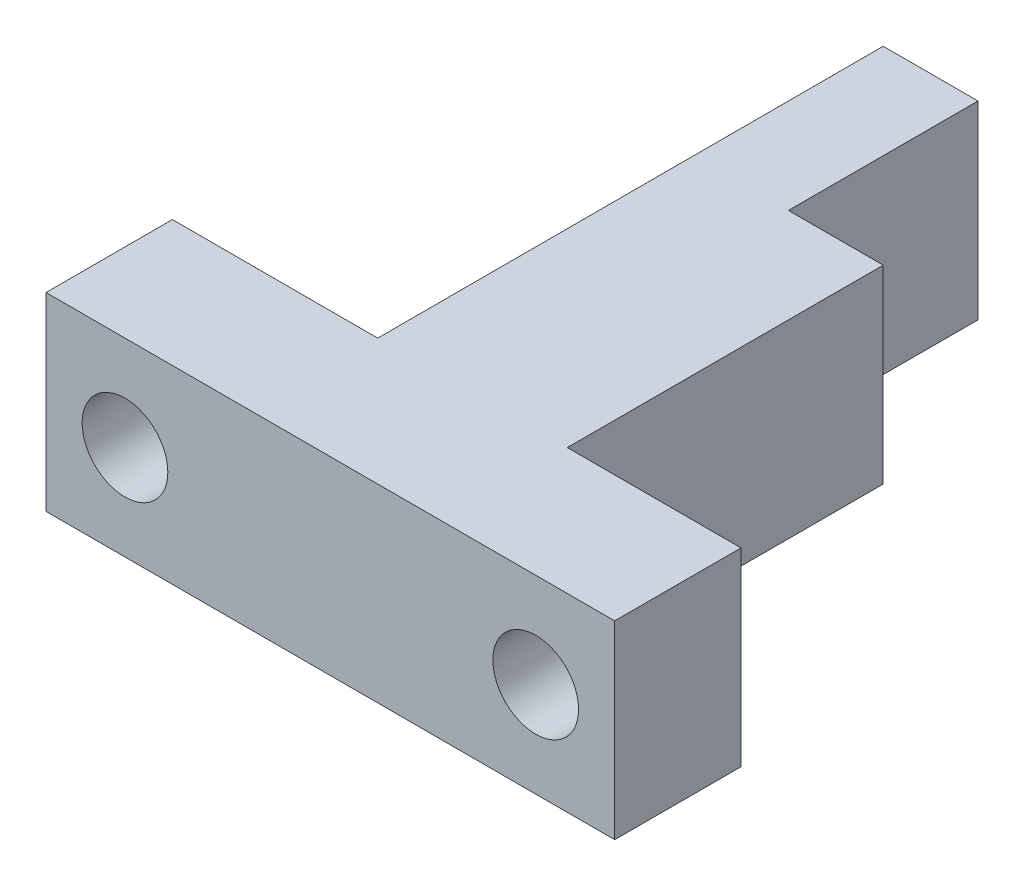
ISO-10303-21;
HEADER;
FILE_DESCRIPTION(('STEP AP214'),'2;1');
FILE_NAME('part.step','',(''),(''),'','','');
FILE_SCHEMA(('AUTOMOTIVE_DESIGN { 1 0 10303 214 1 1 1 1 }'));
ENDSEC;
DATA;
#1=APPLICATION_CONTEXT('core data for automotive mechanical design processes');
#2=APPLICATION_PROTOCOL_DEFINITION('international standard','automotive_design',2000,#1);
#3=PRODUCT_CONTEXT('',#1,'mechanical');
#4=PRODUCT('Part','Part','',(#3));
#5=PRODUCT_RELATED_PRODUCT_CATEGORY('part','',(#4));
#6=PRODUCT_DEFINITION_FORMATION('','',#4);
#7=PRODUCT_DEFINITION_CONTEXT('part definition',#1,'design');
#8=PRODUCT_DEFINITION('design','',#6,#7);
#9=PRODUCT_DEFINITION_SHAPE('','',#8);
#10=(LENGTH_UNIT() NAMED_UNIT(*) SI_UNIT(.MILLI.,.METRE.));
#11=(NAMED_UNIT(*) PLANE_ANGLE_UNIT() SI_UNIT($,.RADIAN.));
#12=(NAMED_UNIT(*) SI_UNIT($,.STERADIAN.) SOLID_ANGLE_UNIT());
#13=UNCERTAINTY_MEASURE_WITH_UNIT(LENGTH_MEASURE(1.E-05),#10,'distance_accuracy_value','');
#14=(GEOMETRIC_REPRESENTATION_CONTEXT(3) GLOBAL_UNCERTAINTY_ASSIGNED_CONTEXT((#13)) GLOBAL_UNIT_ASSIGNED_CONTEXT((#10,
#11,#12)) REPRESENTATION_CONTEXT('',''));
#15=CARTESIAN_POINT('',(0.,0.,0.));
#16=DIRECTION('',(0.,0.,1.));
#17=DIRECTION('',(1.,0.,0.));
#18=AXIS2_PLACEMENT_3D('',#15,#16,#17);
#19=CARTESIAN_POINT('',(-14.2875,9.525,0.));
#20=DIRECTION('',(1.,0.,0.));
#21=DIRECTION('',(0.,0.,-1.));
#22=AXIS2_PLACEMENT_3D('',#19,#20,#21);
#23=PLANE('',#22);
#24=DIRECTION('',(0.,0.,1.));
#25=VECTOR('',#24,1.);
#26=CARTESIAN_POINT('',(-14.2875,0.,0.));
#27=LINE('',#26,#25);
#28=CARTESIAN_POINT('',(-14.2875,0.,-6.35));
#29=VERTEX_POINT('',#28);
#30=CARTESIAN_POINT('',(-14.2875,0.,0.));
#31=VERTEX_POINT('',#30);
#32=EDGE_CURVE('E145',#29,#31,#27,.T.);
#33=ORIENTED_EDGE('',*,*,#32,.T.);
#34=DIRECTION('',(0.,-1.,0.));
#35=VECTOR('',#34,1.);
#36=CARTESIAN_POINT('',(-14.2875,9.525,0.));
#37=LINE('',#36,#35);
#38=CARTESIAN_POINT('',(-14.2875,9.525,0.));
#39=VERTEX_POINT('',#38);
#40=EDGE_CURVE('E11',#39,#31,#37,.T.);
#41=ORIENTED_EDGE('',*,*,#40,.F.);
#42=DIRECTION('',(0.,0.,1.));
#43=VECTOR('',#42,1.);
#44=CARTESIAN_POINT('',(-14.2875,9.525,0.));
#45=LINE('',#44,#43);
#46=CARTESIAN_POINT('',(-14.2875,9.525,-6.35));
#47=VERTEX_POINT('',#46);
#48=EDGE_CURVE('E164',#47,#39,#45,.T.);
#49=ORIENTED_EDGE('',*,*,#48,.F.);
#50=DIRECTION('',(0.,-1.,0.));
#51=VECTOR('',#50,1.);
#52=CARTESIAN_POINT('',(-14.2875,9.525,-6.35));
#53=LINE('',#52,#51);
#54=EDGE_CURVE('E141',#47,#29,#53,.T.);
#55=ORIENTED_EDGE('',*,*,#54,.T.);
#56=EDGE_LOOP('',(#33,#41,#49,#55));
#57=FACE_BOUND('',#56,.T.);
#58=ADVANCED_FACE('F35',(#57),#23,.F.);
#59=CARTESIAN_POINT('',(-14.2875,9.525,0.));
#60=DIRECTION('',(0.,0.,-1.));
#61=DIRECTION('',(-1.,0.,0.));
#62=AXIS2_PLACEMENT_3D('',#59,#60,#61);
#63=PLANE('',#62);
#64=CARTESIAN_POINT('',(10.31875,4.7625,0.));
#65=DIRECTION('',(0.,0.,1.));
#66=DIRECTION('',(1.,0.,0.));
#67=AXIS2_PLACEMENT_3D('',#64,#65,#66);
#68=CIRCLE('',#67,2.15265);
#69=CARTESIAN_POINT('',(12.4714,4.7625,0.));
#70=VERTEX_POINT('',#69);
#71=EDGE_CURVE('E190',#70,#70,#68,.T.);
#72=ORIENTED_EDGE('',*,*,#71,.F.);
#73=EDGE_LOOP('',(#72));
#74=FACE_BOUND('',#73,.T.);
#75=CARTESIAN_POINT('',(-10.31875,4.7625,0.));
#76=DIRECTION('',(0.,0.,1.));
#77=DIRECTION('',(1.,0.,0.));
#78=AXIS2_PLACEMENT_3D('',#75,#76,#77);
#79=CIRCLE('',#78,2.15265);
#80=CARTESIAN_POINT('',(-8.1661,4.7625,0.));
#81=VERTEX_POINT('',#80);
#82=EDGE_CURVE('E182',#81,#81,#79,.T.);
#83=ORIENTED_EDGE('',*,*,#82,.F.);
#84=EDGE_LOOP('',(#83));
#85=FACE_BOUND('',#84,.T.);
#86=DIRECTION('',(1.,0.,0.));
#87=VECTOR('',#86,1.);
#88=CARTESIAN_POINT('',(-14.2875,0.,0.));
#89=LINE('',#88,#87);
#90=CARTESIAN_POINT('',(14.2875,0.,0.));
#91=VERTEX_POINT('',#90);
#92=EDGE_CURVE('E148',#31,#91,#89,.T.);
#93=ORIENTED_EDGE('',*,*,#92,.T.);
#94=DIRECTION('',(0.,-1.,0.));
#95=VECTOR('',#94,1.);
#96=CARTESIAN_POINT('',(14.2875,9.525,0.));
#97=LINE('',#96,#95);
#98=CARTESIAN_POINT('',(14.2875,9.525,0.));
#99=VERTEX_POINT('',#98);
#100=EDGE_CURVE('E44',#99,#91,#97,.T.);
#101=ORIENTED_EDGE('',*,*,#100,.F.);
#102=DIRECTION('',(1.,0.,0.));
#103=VECTOR('',#102,1.);
#104=CARTESIAN_POINT('',(-14.2875,9.525,0.));
#105=LINE('',#104,#103);
#106=EDGE_CURVE('E102',#39,#99,#105,.T.);
#107=ORIENTED_EDGE('',*,*,#106,.F.);
#108=ORIENTED_EDGE('',*,*,#40,.T.);
#109=EDGE_LOOP('',(#93,#101,#107,#108));
#110=FACE_BOUND('',#109,.T.);
#111=ADVANCED_FACE('F230',(#74,#85,#110),#63,.F.);
#112=CARTESIAN_POINT('',(14.2875,9.525,-6.35));
#113=DIRECTION('',(-1.,0.,0.));
#114=DIRECTION('',(0.,0.,1.));
#115=AXIS2_PLACEMENT_3D('',#112,#113,#114);
#116=PLANE('',#115);
#117=DIRECTION('',(0.,0.,-1.));
#118=VECTOR('',#117,1.);
#119=CARTESIAN_POINT('',(14.2875,0.,-6.35));
#120=LINE('',#119,#118);
#121=CARTESIAN_POINT('',(14.2875,0.,-6.35));
#122=VERTEX_POINT('',#121);
#123=EDGE_CURVE('E151',#91,#122,#120,.T.);
#124=ORIENTED_EDGE('',*,*,#123,.T.);
#125=DIRECTION('',(0.,-1.,0.));
#126=VECTOR('',#125,1.);
#127=CARTESIAN_POINT('',(14.2875,9.525,-6.35));
#128=LINE('',#127,#126);
#129=CARTESIAN_POINT('',(14.2875,9.525,-6.35));
#130=VERTEX_POINT('',#129);
#131=EDGE_CURVE('E177',#130,#122,#128,.T.);
#132=ORIENTED_EDGE('',*,*,#131,.F.);
#133=DIRECTION('',(0.,0.,-1.));
#134=VECTOR('',#133,1.);
#135=CARTESIAN_POINT('',(14.2875,9.525,-6.35));
#136=LINE('',#135,#134);
#137=EDGE_CURVE('E195',#99,#130,#136,.T.);
#138=ORIENTED_EDGE('',*,*,#137,.F.);
#139=ORIENTED_EDGE('',*,*,#100,.T.);
#140=EDGE_LOOP('',(#124,#132,#138,#139));
#141=FACE_BOUND('',#140,.T.);
#142=ADVANCED_FACE('F234',(#141),#116,.F.);
#143=CARTESIAN_POINT('',(5.55625,9.525,-6.35));
#144=DIRECTION('',(0.,0.,1.));
#145=DIRECTION('',(1.,0.,0.));
#146=AXIS2_PLACEMENT_3D('',#143,#144,#145);
#147=PLANE('',#146);
#148=CARTESIAN_POINT('',(10.31875,4.7625,-6.35));
#149=DIRECTION('',(0.,0.,1.));
#150=DIRECTION('',(1.,0.,0.));
#151=AXIS2_PLACEMENT_3D('',#148,#149,#150);
#152=CIRCLE('',#151,2.15265);
#153=CARTESIAN_POINT('',(12.4714,4.7625,-6.35000000000001));
#154=VERTEX_POINT('',#153);
#155=EDGE_CURVE('E38',#154,#154,#152,.T.);
#156=ORIENTED_EDGE('',*,*,#155,.T.);
#157=EDGE_LOOP('',(#156));
#158=FACE_BOUND('',#157,.T.);
#159=DIRECTION('',(-1.,0.,0.));
#160=VECTOR('',#159,1.);
#161=CARTESIAN_POINT('',(5.55625,0.,-6.35));
#162=LINE('',#161,#160);
#163=CARTESIAN_POINT('',(5.55625,0.,-6.35));
#164=VERTEX_POINT('',#163);
#165=EDGE_CURVE('E153',#122,#164,#162,.T.);
#166=ORIENTED_EDGE('',*,*,#165,.T.);
#167=DIRECTION('',(0.,-1.,0.));
#168=VECTOR('',#167,1.);
#169=CARTESIAN_POINT('',(5.55625,9.525,-6.35));
#170=LINE('',#169,#168);
#171=CARTESIAN_POINT('',(5.55625,9.525,-6.35));
#172=VERTEX_POINT('',#171);
#173=EDGE_CURVE('E174',#172,#164,#170,.T.);
#174=ORIENTED_EDGE('',*,*,#173,.F.);
#175=DIRECTION('',(-1.,0.,0.));
#176=VECTOR('',#175,1.);
#177=CARTESIAN_POINT('',(5.55625,9.525,-6.35));
#178=LINE('',#177,#176);
#179=EDGE_CURVE('E197',#130,#172,#178,.T.);
#180=ORIENTED_EDGE('',*,*,#179,.F.);
#181=ORIENTED_EDGE('',*,*,#131,.T.);
#182=EDGE_LOOP('',(#166,#174,#180,#181));
#183=FACE_BOUND('',#182,.T.);
#184=ADVANCED_FACE('F239',(#158,#183),#147,.F.);
#185=CARTESIAN_POINT('',(5.55624999999999,9.525,-22.225));
#186=DIRECTION('',(-1.,0.,0.));
#187=DIRECTION('',(0.,0.,1.));
#188=AXIS2_PLACEMENT_3D('',#185,#186,#187);
#189=PLANE('',#188);
#190=DIRECTION('',(0.,0.,-1.));
#191=VECTOR('',#190,1.);
#192=CARTESIAN_POINT('',(5.55624999999999,0.,-22.225));
#193=LINE('',#192,#191);
#194=CARTESIAN_POINT('',(5.55624999999999,0.,-22.225));
#195=VERTEX_POINT('',#194);
#196=EDGE_CURVE('E155',#164,#195,#193,.T.);
#197=ORIENTED_EDGE('',*,*,#196,.T.);
#198=DIRECTION('',(0.,-1.,0.));
#199=VECTOR('',#198,1.);
#200=CARTESIAN_POINT('',(5.55624999999999,9.525,-22.225));
#201=LINE('',#200,#199);
#202=CARTESIAN_POINT('',(5.55624999999999,9.525,-22.225));
#203=VERTEX_POINT('',#202);
#204=EDGE_CURVE('E171',#203,#195,#201,.T.);
#205=ORIENTED_EDGE('',*,*,#204,.F.);
#206=DIRECTION('',(0.,0.,-1.));
#207=VECTOR('',#206,1.);
#208=CARTESIAN_POINT('',(5.55624999999999,9.525,-22.225));
#209=LINE('',#208,#207);
#210=EDGE_CURVE('E199',#172,#203,#209,.T.);
#211=ORIENTED_EDGE('',*,*,#210,.F.);
#212=ORIENTED_EDGE('',*,*,#173,.T.);
#213=EDGE_LOOP('',(#197,#205,#211,#212));
#214=FACE_BOUND('',#213,.T.);
#215=ADVANCED_FACE('F247',(#214),#189,.F.);
#216=CARTESIAN_POINT('',(0.793749999999994,9.525,-22.225));
#217=DIRECTION('',(0.,0.,1.));
#218=DIRECTION('',(1.,0.,0.));
#219=AXIS2_PLACEMENT_3D('',#216,#217,#218);
#220=PLANE('',#219);
#221=DIRECTION('',(-1.,0.,0.));
#222=VECTOR('',#221,1.);
#223=CARTESIAN_POINT('',(0.793749999999994,0.,-22.225));
#224=LINE('',#223,#222);
#225=CARTESIAN_POINT('',(0.793749999999994,0.,-22.225));
#226=VERTEX_POINT('',#225);
#227=EDGE_CURVE('E157',#195,#226,#224,.T.);
#228=ORIENTED_EDGE('',*,*,#227,.T.);
#229=DIRECTION('',(0.,-1.,0.));
#230=VECTOR('',#229,1.);
#231=CARTESIAN_POINT('',(0.793749999999994,9.525,-22.225));
#232=LINE('',#231,#230);
#233=CARTESIAN_POINT('',(0.793749999999994,9.525,-22.225));
#234=VERTEX_POINT('',#233);
#235=EDGE_CURVE('E168',#234,#226,#232,.T.);
#236=ORIENTED_EDGE('',*,*,#235,.F.);
#237=DIRECTION('',(-1.,0.,0.));
#238=VECTOR('',#237,1.);
#239=CARTESIAN_POINT('',(0.793749999999994,9.525,-22.225));
#240=LINE('',#239,#238);
#241=EDGE_CURVE('E201',#203,#234,#240,.T.);
#242=ORIENTED_EDGE('',*,*,#241,.F.);
#243=ORIENTED_EDGE('',*,*,#204,.T.);
#244=EDGE_LOOP('',(#228,#236,#242,#243));
#245=FACE_BOUND('',#244,.T.);
#246=ADVANCED_FACE('F207',(#245),#220,.F.);
#247=CARTESIAN_POINT('',(0.79374999999999,9.525,-31.75));
#248=DIRECTION('',(-1.,0.,0.));
#249=DIRECTION('',(0.,0.,1.));
#250=AXIS2_PLACEMENT_3D('',#247,#248,#249);
#251=PLANE('',#250);
#252=DIRECTION('',(0.,0.,-1.));
#253=VECTOR('',#252,1.);
#254=CARTESIAN_POINT('',(0.79374999999999,0.,-31.75));
#255=LINE('',#254,#253);
#256=CARTESIAN_POINT('',(0.79374999999999,0.,-31.75));
#257=VERTEX_POINT('',#256);
#258=EDGE_CURVE('E159',#226,#257,#255,.T.);
#259=ORIENTED_EDGE('',*,*,#258,.T.);
#260=DIRECTION('',(0.,-1.,0.));
#261=VECTOR('',#260,1.);
#262=CARTESIAN_POINT('',(0.79374999999999,9.525,-31.75));
#263=LINE('',#262,#261);
#264=CARTESIAN_POINT('',(0.79374999999999,9.525,-31.75));
#265=VERTEX_POINT('',#264);
#266=EDGE_CURVE('E136',#265,#257,#263,.T.);
#267=ORIENTED_EDGE('',*,*,#266,.F.);
#268=DIRECTION('',(0.,0.,-1.));
#269=VECTOR('',#268,1.);
#270=CARTESIAN_POINT('',(0.79374999999999,9.525,-31.75));
#271=LINE('',#270,#269);
#272=EDGE_CURVE('E127',#234,#265,#271,.T.);
#273=ORIENTED_EDGE('',*,*,#272,.F.);
#274=ORIENTED_EDGE('',*,*,#235,.T.);
#275=EDGE_LOOP('',(#259,#267,#273,#274));
#276=FACE_BOUND('',#275,.T.);
#277=ADVANCED_FACE('F211',(#276),#251,.F.);
#278=CARTESIAN_POINT('',(-3.96875000000001,9.525,-31.75));
#279=DIRECTION('',(0.,0.,1.));
#280=DIRECTION('',(1.,0.,0.));
#281=AXIS2_PLACEMENT_3D('',#278,#279,#280);
#282=PLANE('',#281);
#283=DIRECTION('',(-1.,0.,0.));
#284=VECTOR('',#283,1.);
#285=CARTESIAN_POINT('',(-3.96875000000001,0.,-31.75));
#286=LINE('',#285,#284);
#287=CARTESIAN_POINT('',(-3.96875000000001,0.,-31.75));
#288=VERTEX_POINT('',#287);
#289=EDGE_CURVE('E135',#257,#288,#286,.T.);
#290=ORIENTED_EDGE('',*,*,#289,.T.);
#291=DIRECTION('',(0.,-1.,0.));
#292=VECTOR('',#291,1.);
#293=CARTESIAN_POINT('',(-3.96875000000001,9.525,-31.75));
#294=LINE('',#293,#292);
#295=CARTESIAN_POINT('',(-3.96875000000001,9.525,-31.75));
#296=VERTEX_POINT('',#295);
#297=EDGE_CURVE('E132',#296,#288,#294,.T.);
#298=ORIENTED_EDGE('',*,*,#297,.F.);
#299=DIRECTION('',(-1.,0.,0.));
#300=VECTOR('',#299,1.);
#301=CARTESIAN_POINT('',(-3.96875000000001,9.525,-31.75));
#302=LINE('',#301,#300);
#303=EDGE_CURVE('E121',#265,#296,#302,.T.);
#304=ORIENTED_EDGE('',*,*,#303,.F.);
#305=ORIENTED_EDGE('',*,*,#266,.T.);
#306=EDGE_LOOP('',(#290,#298,#304,#305));
#307=FACE_BOUND('',#306,.T.);
#308=ADVANCED_FACE('F133',(#307),#282,.F.);
#309=CARTESIAN_POINT('',(-3.96875000000001,9.525,-6.35));
#310=DIRECTION('',(1.,0.,0.));
#311=DIRECTION('',(0.,0.,-1.));
#312=AXIS2_PLACEMENT_3D('',#309,#310,#311);
#313=PLANE('',#312);
#314=DIRECTION('',(0.,0.,1.));
#315=VECTOR('',#314,1.);
#316=CARTESIAN_POINT('',(-3.96875000000001,0.,-6.35));
#317=LINE('',#316,#315);
#318=CARTESIAN_POINT('',(-3.96875000000001,0.,-6.35));
#319=VERTEX_POINT('',#318);
#320=EDGE_CURVE('E88',#288,#319,#317,.T.);
#321=ORIENTED_EDGE('',*,*,#320,.T.);
#322=DIRECTION('',(0.,-1.,0.));
#323=VECTOR('',#322,1.);
#324=CARTESIAN_POINT('',(-3.96875000000001,9.525,-6.35));
#325=LINE('',#324,#323);
#326=CARTESIAN_POINT('',(-3.96875000000001,9.525,-6.35));
#327=VERTEX_POINT('',#326);
#328=EDGE_CURVE('E137',#327,#319,#325,.T.);
#329=ORIENTED_EDGE('',*,*,#328,.F.);
#330=DIRECTION('',(0.,0.,1.));
#331=VECTOR('',#330,1.);
#332=CARTESIAN_POINT('',(-3.96875000000001,9.525,-6.35));
#333=LINE('',#332,#331);
#334=EDGE_CURVE('E125',#296,#327,#333,.T.);
#335=ORIENTED_EDGE('',*,*,#334,.F.);
#336=ORIENTED_EDGE('',*,*,#297,.T.);
#337=EDGE_LOOP('',(#321,#329,#335,#336));
#338=FACE_BOUND('',#337,.T.);
#339=ADVANCED_FACE('F139',(#338),#313,.F.);
#340=CARTESIAN_POINT('',(-14.2875,9.525,-6.35));
#341=DIRECTION('',(0.,0.,1.));
#342=DIRECTION('',(1.,0.,0.));
#343=AXIS2_PLACEMENT_3D('',#340,#341,#342);
#344=PLANE('',#343);
#345=CARTESIAN_POINT('',(-10.31875,4.7625,-6.35));
#346=DIRECTION('',(0.,0.,1.));
#347=DIRECTION('',(1.,0.,0.));
#348=AXIS2_PLACEMENT_3D('',#345,#346,#347);
#349=CIRCLE('',#348,2.15265);
#350=CARTESIAN_POINT('',(-8.1661,4.7625,-6.35));
#351=VERTEX_POINT('',#350);
#352=EDGE_CURVE('E149',#351,#351,#349,.T.);
#353=ORIENTED_EDGE('',*,*,#352,.T.);
#354=EDGE_LOOP('',(#353));
#355=FACE_BOUND('',#354,.T.);
#356=DIRECTION('',(-1.,0.,0.));
#357=VECTOR('',#356,1.);
#358=CARTESIAN_POINT('',(-14.2875,0.,-6.35));
#359=LINE('',#358,#357);
#360=EDGE_CURVE('E94',#319,#29,#359,.T.);
#361=ORIENTED_EDGE('',*,*,#360,.T.);
#362=ORIENTED_EDGE('',*,*,#54,.F.);
#363=DIRECTION('',(-1.,0.,0.));
#364=VECTOR('',#363,1.);
#365=CARTESIAN_POINT('',(-14.2875,9.525,-6.35));
#366=LINE('',#365,#364);
#367=EDGE_CURVE('E53',#327,#47,#366,.T.);
#368=ORIENTED_EDGE('',*,*,#367,.F.);
#369=ORIENTED_EDGE('',*,*,#328,.T.);
#370=EDGE_LOOP('',(#361,#362,#368,#369));
#371=FACE_BOUND('',#370,.T.);
#372=ADVANCED_FACE('F219',(#355,#371),#344,.F.);
#373=CARTESIAN_POINT('',(0.,9.525,0.));
#374=DIRECTION('',(0.,-1.,0.));
#375=DIRECTION('',(0.,0.,-1.));
#376=AXIS2_PLACEMENT_3D('',#373,#374,#375);
#377=PLANE('',#376);
#378=ORIENTED_EDGE('',*,*,#48,.T.);
#379=ORIENTED_EDGE('',*,*,#106,.T.);
#380=ORIENTED_EDGE('',*,*,#137,.T.);
#381=ORIENTED_EDGE('',*,*,#179,.T.);
#382=ORIENTED_EDGE('',*,*,#210,.T.);
#383=ORIENTED_EDGE('',*,*,#241,.T.);
#384=ORIENTED_EDGE('',*,*,#272,.T.);
#385=ORIENTED_EDGE('',*,*,#303,.T.);
#386=ORIENTED_EDGE('',*,*,#334,.T.);
#387=ORIENTED_EDGE('',*,*,#367,.T.);
#388=EDGE_LOOP('',(#378,#379,#380,#381,#382,#383,#384,#385,#386,#387));
#389=FACE_BOUND('',#388,.T.);
#390=ADVANCED_FACE('F123',(#389),#377,.F.);
#391=CARTESIAN_POINT('',(0.,0.,0.));
#392=DIRECTION('',(0.,-1.,0.));
#393=DIRECTION('',(0.,0.,-1.));
#394=AXIS2_PLACEMENT_3D('',#391,#392,#393);
#395=PLANE('',#394);
#396=ORIENTED_EDGE('',*,*,#32,.F.);
#397=ORIENTED_EDGE('',*,*,#360,.F.);
#398=ORIENTED_EDGE('',*,*,#320,.F.);
#399=ORIENTED_EDGE('',*,*,#289,.F.);
#400=ORIENTED_EDGE('',*,*,#258,.F.);
#401=ORIENTED_EDGE('',*,*,#227,.F.);
#402=ORIENTED_EDGE('',*,*,#196,.F.);
#403=ORIENTED_EDGE('',*,*,#165,.F.);
#404=ORIENTED_EDGE('',*,*,#123,.F.);
#405=ORIENTED_EDGE('',*,*,#92,.F.);
#406=EDGE_LOOP('',(#396,#397,#398,#399,#400,#401,#402,#403,#404,#405));
#407=FACE_BOUND('',#406,.T.);
#408=ADVANCED_FACE('F214',(#407),#395,.T.);
#409=CARTESIAN_POINT('',(-10.31875,4.7625,-31.75));
#410=DIRECTION('',(0.,0.,1.));
#411=DIRECTION('',(1.,0.,0.));
#412=AXIS2_PLACEMENT_3D('',#409,#410,#411);
#413=CYLINDRICAL_SURFACE('',#412,2.15265);
#414=ORIENTED_EDGE('',*,*,#82,.T.);
#415=EDGE_LOOP('',(#414));
#416=FACE_BOUND('',#415,.T.);
#417=ORIENTED_EDGE('',*,*,#352,.F.);
#418=EDGE_LOOP('',(#417));
#419=FACE_BOUND('',#418,.T.);
#420=ADVANCED_FACE('F280',(#416,#419),#413,.F.);
#421=CARTESIAN_POINT('',(10.31875,4.7625,-31.75));
#422=DIRECTION('',(0.,0.,1.));
#423=DIRECTION('',(1.,0.,0.));
#424=AXIS2_PLACEMENT_3D('',#421,#422,#423);
#425=CYLINDRICAL_SURFACE('',#424,2.15265);
#426=ORIENTED_EDGE('',*,*,#71,.T.);
#427=EDGE_LOOP('',(#426));
#428=FACE_BOUND('',#427,.T.);
#429=ORIENTED_EDGE('',*,*,#155,.F.);
#430=EDGE_LOOP('',(#429));
#431=FACE_BOUND('',#430,.T.);
#432=ADVANCED_FACE('F305',(#428,#431),#425,.F.);
#433=CLOSED_SHELL('',(#58,#111,#142,#184,#215,#246,#277,#308,#339,#372,#390,#408,#420,#432));
#434=MANIFOLD_SOLID_BREP('B2',#433);
#435=ADVANCED_BREP_SHAPE_REPRESENTATION('',(#18,#434),#14);
#436=SHAPE_DEFINITION_REPRESENTATION(#9,#435);
ENDSEC;
END-ISO-10303-21;
